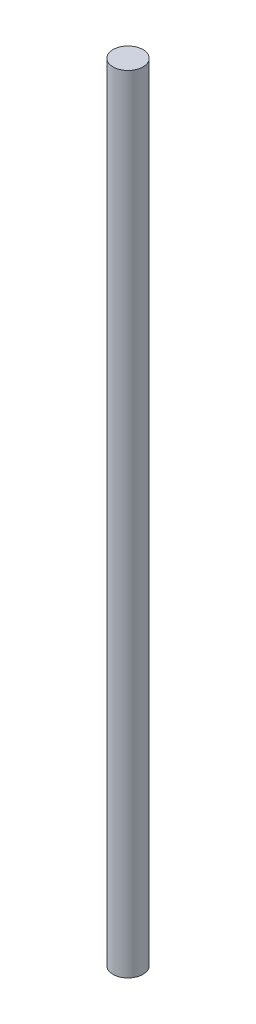
ISO-10303-21;
HEADER;
FILE_DESCRIPTION(('STEP AP214'),'2;1');
FILE_NAME('part.step','',(''),(''),'','','');
FILE_SCHEMA(('AUTOMOTIVE_DESIGN { 1 0 10303 214 1 1 1 1 }'));
ENDSEC;
DATA;
#1=APPLICATION_CONTEXT('core data for automotive mechanical design processes');
#2=APPLICATION_PROTOCOL_DEFINITION('international standard','automotive_design',2000,#1);
#3=PRODUCT_CONTEXT('',#1,'mechanical');
#4=PRODUCT('Part','Part','',(#3));
#5=PRODUCT_RELATED_PRODUCT_CATEGORY('part','',(#4));
#6=PRODUCT_DEFINITION_FORMATION('','',#4);
#7=PRODUCT_DEFINITION_CONTEXT('part definition',#1,'design');
#8=PRODUCT_DEFINITION('design','',#6,#7);
#9=PRODUCT_DEFINITION_SHAPE('','',#8);
#10=(LENGTH_UNIT() NAMED_UNIT(*) SI_UNIT(.MILLI.,.METRE.));
#11=(NAMED_UNIT(*) PLANE_ANGLE_UNIT() SI_UNIT($,.RADIAN.));
#12=(NAMED_UNIT(*) SI_UNIT($,.STERADIAN.) SOLID_ANGLE_UNIT());
#13=UNCERTAINTY_MEASURE_WITH_UNIT(LENGTH_MEASURE(1.E-05),#10,'distance_accuracy_value','');
#14=(GEOMETRIC_REPRESENTATION_CONTEXT(3) GLOBAL_UNCERTAINTY_ASSIGNED_CONTEXT((#13)) GLOBAL_UNIT_ASSIGNED_CONTEXT((#10,
#11,#12)) REPRESENTATION_CONTEXT('',''));
#15=CARTESIAN_POINT('',(0.,0.,0.));
#16=DIRECTION('',(0.,0.,1.));
#17=DIRECTION('',(1.,0.,0.));
#18=AXIS2_PLACEMENT_3D('',#15,#16,#17);
#19=CARTESIAN_POINT('',(0.,152.4,0.));
#20=DIRECTION('',(0.,-1.,0.));
#21=DIRECTION('',(0.,0.,-1.));
#22=AXIS2_PLACEMENT_3D('',#19,#20,#21);
#23=CYLINDRICAL_SURFACE('',#22,2.9083);
#24=CARTESIAN_POINT('',(0.,152.4,0.));
#25=DIRECTION('',(0.,1.,0.));
#26=DIRECTION('',(0.,0.,1.));
#27=AXIS2_PLACEMENT_3D('',#24,#25,#26);
#28=CIRCLE('',#27,2.9083);
#29=CARTESIAN_POINT('',(0.,152.4,-2.9083));
#30=VERTEX_POINT('',#29);
#31=EDGE_CURVE('E10',#30,#30,#28,.T.);
#32=CARTESIAN_POINT('',(0.,0.,0.));
#33=DIRECTION('',(0.,1.,0.));
#34=DIRECTION('',(0.,0.,1.));
#35=AXIS2_PLACEMENT_3D('',#32,#33,#34);
#36=CIRCLE('',#35,2.9083);
#37=CARTESIAN_POINT('',(0.,0.,-2.9083));
#38=VERTEX_POINT('',#37);
#39=EDGE_CURVE('E40',#38,#38,#36,.T.);
#40=CARTESIAN_POINT('',(0.,152.4,-2.9083));
#41=CARTESIAN_POINT('',(0.,150.8125,-2.9083));
#42=CARTESIAN_POINT('',(0.,149.225,-2.9083));
#43=CARTESIAN_POINT('',(0.,146.05,-2.9083));
#44=CARTESIAN_POINT('',(0.,144.4625,-2.9083));
#45=CARTESIAN_POINT('',(0.,141.2875,-2.9083));
#46=CARTESIAN_POINT('',(0.,139.7,-2.9083));
#47=CARTESIAN_POINT('',(0.,136.525,-2.9083));
#48=CARTESIAN_POINT('',(0.,134.9375,-2.9083));
#49=CARTESIAN_POINT('',(0.,131.7625,-2.9083));
#50=CARTESIAN_POINT('',(0.,130.175,-2.9083));
#51=CARTESIAN_POINT('',(0.,127.,-2.9083));
#52=CARTESIAN_POINT('',(0.,125.4125,-2.9083));
#53=CARTESIAN_POINT('',(0.,122.2375,-2.9083));
#54=CARTESIAN_POINT('',(0.,120.65,-2.9083));
#55=CARTESIAN_POINT('',(0.,117.475,-2.9083));
#56=CARTESIAN_POINT('',(0.,115.8875,-2.9083));
#57=CARTESIAN_POINT('',(0.,112.7125,-2.9083));
#58=CARTESIAN_POINT('',(0.,111.125,-2.9083));
#59=CARTESIAN_POINT('',(0.,107.95,-2.9083));
#60=CARTESIAN_POINT('',(0.,106.3625,-2.9083));
#61=CARTESIAN_POINT('',(0.,103.1875,-2.9083));
#62=CARTESIAN_POINT('',(0.,101.6,-2.9083));
#63=CARTESIAN_POINT('',(0.,98.425,-2.9083));
#64=CARTESIAN_POINT('',(0.,96.8375,-2.9083));
#65=CARTESIAN_POINT('',(0.,93.6625,-2.9083));
#66=CARTESIAN_POINT('',(0.,92.075,-2.9083));
#67=CARTESIAN_POINT('',(0.,88.9,-2.9083));
#68=CARTESIAN_POINT('',(0.,87.3125,-2.9083));
#69=CARTESIAN_POINT('',(0.,84.1375,-2.9083));
#70=CARTESIAN_POINT('',(0.,82.55,-2.9083));
#71=CARTESIAN_POINT('',(0.,79.375,-2.9083));
#72=CARTESIAN_POINT('',(0.,77.7875,-2.9083));
#73=CARTESIAN_POINT('',(0.,74.6125,-2.9083));
#74=CARTESIAN_POINT('',(0.,73.025,-2.9083));
#75=CARTESIAN_POINT('',(0.,69.85,-2.9083));
#76=CARTESIAN_POINT('',(0.,68.2625,-2.9083));
#77=CARTESIAN_POINT('',(0.,65.0875,-2.9083));
#78=CARTESIAN_POINT('',(0.,63.5,-2.9083));
#79=CARTESIAN_POINT('',(0.,60.325,-2.9083));
#80=CARTESIAN_POINT('',(0.,58.7375,-2.9083));
#81=CARTESIAN_POINT('',(0.,55.5625,-2.9083));
#82=CARTESIAN_POINT('',(0.,53.975,-2.9083));
#83=CARTESIAN_POINT('',(0.,50.8,-2.9083));
#84=CARTESIAN_POINT('',(0.,49.2125,-2.9083));
#85=CARTESIAN_POINT('',(0.,46.0375,-2.9083));
#86=CARTESIAN_POINT('',(0.,44.45,-2.9083));
#87=CARTESIAN_POINT('',(0.,41.275,-2.9083));
#88=CARTESIAN_POINT('',(0.,39.6875,-2.9083));
#89=CARTESIAN_POINT('',(0.,36.5125,-2.9083));
#90=CARTESIAN_POINT('',(0.,34.925,-2.9083));
#91=CARTESIAN_POINT('',(0.,31.75,-2.9083));
#92=CARTESIAN_POINT('',(0.,30.1625,-2.9083));
#93=CARTESIAN_POINT('',(0.,26.9875,-2.9083));
#94=CARTESIAN_POINT('',(0.,25.4,-2.9083));
#95=CARTESIAN_POINT('',(0.,22.225,-2.9083));
#96=CARTESIAN_POINT('',(0.,20.6375,-2.9083));
#97=CARTESIAN_POINT('',(0.,17.4625,-2.9083));
#98=CARTESIAN_POINT('',(0.,15.875,-2.9083));
#99=CARTESIAN_POINT('',(0.,12.7,-2.9083));
#100=CARTESIAN_POINT('',(0.,11.1125,-2.9083));
#101=CARTESIAN_POINT('',(0.,7.93750000000001,-2.9083));
#102=CARTESIAN_POINT('',(0.,6.35,-2.9083));
#103=CARTESIAN_POINT('',(0.,3.175,-2.9083));
#104=CARTESIAN_POINT('',(0.,1.5875,-2.9083));
#105=CARTESIAN_POINT('',(0.,0.,-2.9083));
#106=B_SPLINE_CURVE_WITH_KNOTS('',3,(#40,#41,#42,#43,#44,#45,#46,#47,#48,#49,#50,#51,#52,#53,
#54,#55,#56,#57,#58,#59,#60,#61,#62,#63,#64,#65,#66,#67,#68,#69,#70,#71,#72,#73,#74,#75,#76,#77,
#78,#79,#80,#81,#82,#83,#84,#85,#86,#87,#88,#89,#90,#91,#92,#93,#94,#95,#96,#97,#98,#99,#100,
#101,#102,#103,#104,#105),.UNSPECIFIED.,.F.,.F.,(4,2,2,2,2,2,2,2,2,2,2,2,2,2,2,2,2,2,2,2,2,2,2,
2,2,2,2,2,2,2,2,2,4),(0.,4.7625,9.52500000000001,14.2875,19.05,23.8125,28.575,33.3375,38.1,
42.8625,47.625,52.3875,57.15,61.9125,66.675,71.4375,76.2,80.9625,85.725,90.4875,95.25,100.0125,
104.775,109.5375,114.3,119.0625,123.825,128.5875,133.35,138.1125,142.875,147.6375,152.4),.UNSPECIFIED.);
#107=EDGE_CURVE('BSEAM37',#30,#38,#106,.T.);
#108=ORIENTED_EDGE('',*,*,#31,.F.);
#109=ORIENTED_EDGE('',*,*,#39,.T.);
#110=ORIENTED_EDGE('',*,*,#107,.T.);
#111=ORIENTED_EDGE('',*,*,#107,.F.);
#112=EDGE_LOOP('',(#108,#110,#109,#111));
#113=FACE_BOUND('',#112,.T.);
#114=ADVANCED_FACE('F37',(#113),#23,.T.);
#115=CARTESIAN_POINT('',(0.,152.4,0.));
#116=DIRECTION('',(0.,1.,0.));
#117=DIRECTION('',(0.,0.,1.));
#118=AXIS2_PLACEMENT_3D('',#115,#116,#117);
#119=PLANE('',#118);
#120=ORIENTED_EDGE('',*,*,#31,.T.);
#121=EDGE_LOOP('',(#120));
#122=FACE_BOUND('',#121,.T.);
#123=ADVANCED_FACE('F54',(#122),#119,.T.);
#124=CARTESIAN_POINT('',(0.,0.,0.));
#125=DIRECTION('',(0.,1.,0.));
#126=DIRECTION('',(0.,0.,1.));
#127=AXIS2_PLACEMENT_3D('',#124,#125,#126);
#128=PLANE('',#127);
#129=ORIENTED_EDGE('',*,*,#39,.F.);
#130=EDGE_LOOP('',(#129));
#131=FACE_BOUND('',#130,.T.);
#132=ADVANCED_FACE('F52',(#131),#128,.F.);
#133=CLOSED_SHELL('',(#114,#123,#132));
#134=MANIFOLD_SOLID_BREP('B2',#133);
#135=ADVANCED_BREP_SHAPE_REPRESENTATION('',(#18,#134),#14);
#136=SHAPE_DEFINITION_REPRESENTATION(#9,#135);
ENDSEC;
END-ISO-10303-21;
